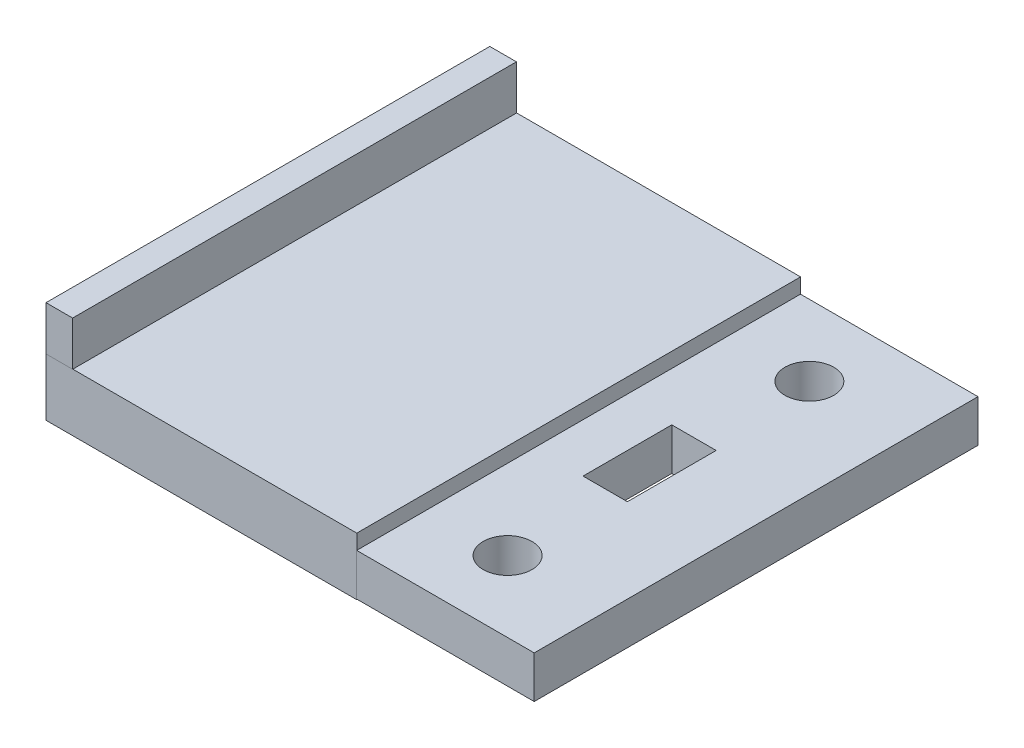
ISO-10303-21;
HEADER;
FILE_DESCRIPTION(('STEP AP214'),'2;1');
FILE_NAME('part.step','',(''),(''),'','','');
FILE_SCHEMA(('AUTOMOTIVE_DESIGN { 1 0 10303 214 1 1 1 1 }'));
ENDSEC;
DATA;
#1=APPLICATION_CONTEXT('core data for automotive mechanical design processes');
#2=APPLICATION_PROTOCOL_DEFINITION('international standard','automotive_design',2000,#1);
#3=PRODUCT_CONTEXT('',#1,'mechanical');
#4=PRODUCT('Part','Part','',(#3));
#5=PRODUCT_RELATED_PRODUCT_CATEGORY('part','',(#4));
#6=PRODUCT_DEFINITION_FORMATION('','',#4);
#7=PRODUCT_DEFINITION_CONTEXT('part definition',#1,'design');
#8=PRODUCT_DEFINITION('design','',#6,#7);
#9=PRODUCT_DEFINITION_SHAPE('','',#8);
#10=(LENGTH_UNIT() NAMED_UNIT(*) SI_UNIT(.MILLI.,.METRE.));
#11=(NAMED_UNIT(*) PLANE_ANGLE_UNIT() SI_UNIT($,.RADIAN.));
#12=(NAMED_UNIT(*) SI_UNIT($,.STERADIAN.) SOLID_ANGLE_UNIT());
#13=UNCERTAINTY_MEASURE_WITH_UNIT(LENGTH_MEASURE(1.E-05),#10,'distance_accuracy_value','');
#14=(GEOMETRIC_REPRESENTATION_CONTEXT(3) GLOBAL_UNCERTAINTY_ASSIGNED_CONTEXT((#13)) GLOBAL_UNIT_ASSIGNED_CONTEXT((#10,
#11,#12)) REPRESENTATION_CONTEXT('',''));
#15=CARTESIAN_POINT('',(0.,0.,0.));
#16=DIRECTION('',(0.,0.,1.));
#17=DIRECTION('',(1.,0.,0.));
#18=AXIS2_PLACEMENT_3D('',#15,#16,#17);
#19=CARTESIAN_POINT('',(-47.6282051282051,6.43167795209814,39.9582652280641));
#20=DIRECTION('',(0.,-1.,0.));
#21=DIRECTION('',(0.,0.,-1.));
#22=AXIS2_PLACEMENT_3D('',#19,#20,#21);
#23=PLANE('',#22);
#24=DIRECTION('',(0.,0.,1.));
#25=VECTOR('',#24,1.);
#26=CARTESIAN_POINT('',(-47.6196859344213,6.43167795209814,-10.0198406725056));
#27=LINE('',#26,#25);
#28=CARTESIAN_POINT('',(-47.6196859344213,6.43167795209814,-10.0198406725056));
#29=VERTEX_POINT('',#28);
#30=CARTESIAN_POINT('',(-47.6196859344213,6.43167795209814,39.9582652280641));
#31=VERTEX_POINT('',#30);
#32=EDGE_CURVE('E220',#29,#31,#27,.T.);
#33=ORIENTED_EDGE('',*,*,#32,.F.);
#34=DIRECTION('',(-1.,0.,0.));
#35=VECTOR('',#34,1.);
#36=CARTESIAN_POINT('',(-47.6196859344213,6.43167795209814,-10.0198406725056));
#37=LINE('',#36,#35);
#38=CARTESIAN_POINT('',(-44.6196859344213,6.43167795209814,-10.0198406725056));
#39=VERTEX_POINT('',#38);
#40=EDGE_CURVE('E210',#39,#29,#37,.T.);
#41=ORIENTED_EDGE('',*,*,#40,.F.);
#42=DIRECTION('',(0.,0.,-1.));
#43=VECTOR('',#42,1.);
#44=CARTESIAN_POINT('',(-44.6196859344213,6.43167795209814,-10.0198406725056));
#45=LINE('',#44,#43);
#46=CARTESIAN_POINT('',(-44.6196859344213,6.43167795209814,39.9582652280641));
#47=VERTEX_POINT('',#46);
#48=EDGE_CURVE('E231',#47,#39,#45,.T.);
#49=ORIENTED_EDGE('',*,*,#48,.F.);
#50=DIRECTION('',(1.,0.,0.));
#51=VECTOR('',#50,1.);
#52=CARTESIAN_POINT('',(-47.6282051282051,6.43167795209814,39.9582652280641));
#53=LINE('',#52,#51);
#54=CARTESIAN_POINT('',(-12.6282051282051,6.43167795209814,39.9582652280641));
#55=VERTEX_POINT('',#54);
#56=EDGE_CURVE('E290',#47,#55,#53,.T.);
#57=ORIENTED_EDGE('',*,*,#56,.T.);
#58=DIRECTION('',(0.,0.,-1.));
#59=VECTOR('',#58,1.);
#60=CARTESIAN_POINT('',(-12.6282051282051,6.43167795209814,39.9582652280641));
#61=LINE('',#60,#59);
#62=CARTESIAN_POINT('',(-12.6282051282051,6.43167795209814,-10.0417347719359));
#63=VERTEX_POINT('',#62);
#64=EDGE_CURVE('E270',#55,#63,#61,.T.);
#65=ORIENTED_EDGE('',*,*,#64,.T.);
#66=DIRECTION('',(1.,0.,0.));
#67=VECTOR('',#66,1.);
#68=CARTESIAN_POINT('',(-47.6282051282051,6.43167795209814,-10.0417347719359));
#69=LINE('',#68,#67);
#70=CARTESIAN_POINT('',(-47.6282051282051,6.43167795209814,-10.0417347719359));
#71=VERTEX_POINT('',#70);
#72=EDGE_CURVE('E286',#71,#63,#69,.T.);
#73=ORIENTED_EDGE('',*,*,#72,.F.);
#74=DIRECTION('',(0.,0.,-1.));
#75=VECTOR('',#74,1.);
#76=CARTESIAN_POINT('',(-47.6282051282051,6.43167795209814,39.9582652280641));
#77=LINE('',#76,#75);
#78=CARTESIAN_POINT('',(-47.6282051282051,6.43167795209814,39.9582652280641));
#79=VERTEX_POINT('',#78);
#80=EDGE_CURVE('E255',#79,#71,#77,.T.);
#81=ORIENTED_EDGE('',*,*,#80,.F.);
#82=EDGE_CURVE('E291',#79,#31,#53,.T.);
#83=ORIENTED_EDGE('',*,*,#82,.T.);
#84=EDGE_LOOP('',(#33,#41,#49,#57,#65,#73,#81,#83));
#85=FACE_BOUND('',#84,.T.);
#86=ADVANCED_FACE('F43',(#85),#23,.F.);
#87=CARTESIAN_POINT('',(-12.6282051282051,4.75,-10.0320512820513));
#88=DIRECTION('',(1.,0.,0.));
#89=DIRECTION('',(0.,0.,-1.));
#90=AXIS2_PLACEMENT_3D('',#87,#88,#89);
#91=PLANE('',#90);
#92=DIRECTION('',(0.,1.,0.));
#93=VECTOR('',#92,1.);
#94=CARTESIAN_POINT('',(-12.6282051282051,-0.0683220479018587,39.9582652280641));
#95=LINE('',#94,#93);
#96=CARTESIAN_POINT('',(-12.6282051282051,0.,39.9582652280641));
#97=VERTEX_POINT('',#96);
#98=CARTESIAN_POINT('',(-12.6282051282051,4.75,39.9582652280641));
#99=VERTEX_POINT('',#98);
#100=EDGE_CURVE('E271',#97,#99,#95,.T.);
#101=ORIENTED_EDGE('',*,*,#100,.F.);
#102=DIRECTION('',(0.,0.,1.));
#103=VECTOR('',#102,1.);
#104=CARTESIAN_POINT('',(-12.6282051282051,0.,-10.0320512820513));
#105=LINE('',#104,#103);
#106=CARTESIAN_POINT('',(-12.6282051282051,0.,39.9679487179487));
#107=VERTEX_POINT('',#106);
#108=EDGE_CURVE('E335',#97,#107,#105,.T.);
#109=ORIENTED_EDGE('',*,*,#108,.T.);
#110=DIRECTION('',(0.,-1.,0.));
#111=VECTOR('',#110,1.);
#112=CARTESIAN_POINT('',(-12.6282051282051,4.75,39.9679487179487));
#113=LINE('',#112,#111);
#114=CARTESIAN_POINT('',(-12.6282051282051,4.75,39.9679487179487));
#115=VERTEX_POINT('',#114);
#116=EDGE_CURVE('E345',#115,#107,#113,.T.);
#117=ORIENTED_EDGE('',*,*,#116,.F.);
#118=DIRECTION('',(0.,0.,1.));
#119=VECTOR('',#118,1.);
#120=CARTESIAN_POINT('',(-12.6282051282051,4.75,-10.0320512820513));
#121=LINE('',#120,#119);
#122=EDGE_CURVE('E321',#99,#115,#121,.T.);
#123=ORIENTED_EDGE('',*,*,#122,.F.);
#124=EDGE_LOOP('',(#101,#109,#117,#123));
#125=FACE_BOUND('',#124,.T.);
#126=ADVANCED_FACE('F383',(#125),#91,.F.);
#127=CARTESIAN_POINT('',(7.37179487179487,4.75,-10.0320512820513));
#128=DIRECTION('',(-1.,0.,0.));
#129=DIRECTION('',(0.,0.,1.));
#130=AXIS2_PLACEMENT_3D('',#127,#128,#129);
#131=PLANE('',#130);
#132=DIRECTION('',(0.,0.,-1.));
#133=VECTOR('',#132,1.);
#134=CARTESIAN_POINT('',(7.37179487179487,0.,-10.0320512820513));
#135=LINE('',#134,#133);
#136=CARTESIAN_POINT('',(7.37179487179488,0.,39.9679487179487));
#137=VERTEX_POINT('',#136);
#138=CARTESIAN_POINT('',(7.37179487179487,0.,-10.0320512820513));
#139=VERTEX_POINT('',#138);
#140=EDGE_CURVE('E301',#137,#139,#135,.T.);
#141=ORIENTED_EDGE('',*,*,#140,.T.);
#142=DIRECTION('',(0.,-1.,0.));
#143=VECTOR('',#142,1.);
#144=CARTESIAN_POINT('',(7.37179487179487,4.75,-10.0320512820513));
#145=LINE('',#144,#143);
#146=CARTESIAN_POINT('',(7.37179487179487,4.75,-10.0320512820513));
#147=VERTEX_POINT('',#146);
#148=EDGE_CURVE('E353',#147,#139,#145,.T.);
#149=ORIENTED_EDGE('',*,*,#148,.F.);
#150=DIRECTION('',(0.,0.,-1.));
#151=VECTOR('',#150,1.);
#152=CARTESIAN_POINT('',(7.37179487179487,4.75,-10.0320512820513));
#153=LINE('',#152,#151);
#154=CARTESIAN_POINT('',(7.37179487179488,4.75,39.9679487179487));
#155=VERTEX_POINT('',#154);
#156=EDGE_CURVE('E313',#155,#147,#153,.T.);
#157=ORIENTED_EDGE('',*,*,#156,.F.);
#158=DIRECTION('',(0.,-1.,0.));
#159=VECTOR('',#158,1.);
#160=CARTESIAN_POINT('',(7.37179487179488,4.75,39.9679487179487));
#161=LINE('',#160,#159);
#162=EDGE_CURVE('E328',#155,#137,#161,.T.);
#163=ORIENTED_EDGE('',*,*,#162,.T.);
#164=EDGE_LOOP('',(#141,#149,#157,#163));
#165=FACE_BOUND('',#164,.T.);
#166=ADVANCED_FACE('F45',(#165),#131,.F.);
#167=CARTESIAN_POINT('',(-12.6282051282051,4.75,-10.0320512820513));
#168=DIRECTION('',(0.,0.,1.));
#169=DIRECTION('',(1.,0.,0.));
#170=AXIS2_PLACEMENT_3D('',#167,#168,#169);
#171=PLANE('',#170);
#172=DIRECTION('',(-1.,0.,0.));
#173=VECTOR('',#172,1.);
#174=CARTESIAN_POINT('',(-12.6282051282051,0.,-10.0320512820513));
#175=LINE('',#174,#173);
#176=CARTESIAN_POINT('',(-12.6282051282051,0.,-10.0320512820513));
#177=VERTEX_POINT('',#176);
#178=EDGE_CURVE('E332',#139,#177,#175,.T.);
#179=ORIENTED_EDGE('',*,*,#178,.T.);
#180=DIRECTION('',(0.,-1.,0.));
#181=VECTOR('',#180,1.);
#182=CARTESIAN_POINT('',(-12.6282051282051,4.75,-10.0320512820513));
#183=LINE('',#182,#181);
#184=CARTESIAN_POINT('',(-12.6282051282051,4.75,-10.0320512820513));
#185=VERTEX_POINT('',#184);
#186=EDGE_CURVE('E349',#185,#177,#183,.T.);
#187=ORIENTED_EDGE('',*,*,#186,.F.);
#188=DIRECTION('',(-1.,0.,0.));
#189=VECTOR('',#188,1.);
#190=CARTESIAN_POINT('',(-12.6282051282051,4.75,-10.0320512820513));
#191=LINE('',#190,#189);
#192=EDGE_CURVE('E317',#147,#185,#191,.T.);
#193=ORIENTED_EDGE('',*,*,#192,.F.);
#194=ORIENTED_EDGE('',*,*,#148,.T.);
#195=EDGE_LOOP('',(#179,#187,#193,#194));
#196=FACE_BOUND('',#195,.T.);
#197=ADVANCED_FACE('F414',(#196),#171,.F.);
#198=CARTESIAN_POINT('',(-12.6282051282051,4.75,39.9679487179487));
#199=DIRECTION('',(0.,0.,-1.));
#200=DIRECTION('',(-1.,0.,0.));
#201=AXIS2_PLACEMENT_3D('',#198,#199,#200);
#202=PLANE('',#201);
#203=DIRECTION('',(1.,0.,0.));
#204=VECTOR('',#203,1.);
#205=CARTESIAN_POINT('',(-12.6282051282051,0.,39.9679487179487));
#206=LINE('',#205,#204);
#207=EDGE_CURVE('E318',#107,#137,#206,.T.);
#208=ORIENTED_EDGE('',*,*,#207,.T.);
#209=ORIENTED_EDGE('',*,*,#162,.F.);
#210=DIRECTION('',(1.,0.,0.));
#211=VECTOR('',#210,1.);
#212=CARTESIAN_POINT('',(-12.6282051282051,4.75,39.9679487179487));
#213=LINE('',#212,#211);
#214=EDGE_CURVE('E325',#115,#155,#213,.T.);
#215=ORIENTED_EDGE('',*,*,#214,.F.);
#216=ORIENTED_EDGE('',*,*,#116,.T.);
#217=EDGE_LOOP('',(#208,#209,#215,#216));
#218=FACE_BOUND('',#217,.T.);
#219=ADVANCED_FACE('F410',(#218),#202,.F.);
#220=CARTESIAN_POINT('',(0.,4.75,0.));
#221=DIRECTION('',(0.,1.,0.));
#222=DIRECTION('',(0.,0.,1.));
#223=AXIS2_PLACEMENT_3D('',#220,#221,#222);
#224=PLANE('',#223);
#225=DIRECTION('',(0.,0.,-1.));
#226=VECTOR('',#225,1.);
#227=CARTESIAN_POINT('',(-2.12820512820513,4.75,9.96794871794872));
#228=LINE('',#227,#226);
#229=CARTESIAN_POINT('',(-2.12820512820513,4.75,19.9679487179487));
#230=VERTEX_POINT('',#229);
#231=CARTESIAN_POINT('',(-2.12820512820513,4.75,9.96794871794872));
#232=VERTEX_POINT('',#231);
#233=EDGE_CURVE('E59',#230,#232,#228,.T.);
#234=ORIENTED_EDGE('',*,*,#233,.F.);
#235=DIRECTION('',(1.,0.,0.));
#236=VECTOR('',#235,1.);
#237=CARTESIAN_POINT('',(-7.12820512820513,4.75,19.9679487179487));
#238=LINE('',#237,#236);
#239=CARTESIAN_POINT('',(-7.12820512820513,4.75,19.9679487179487));
#240=VERTEX_POINT('',#239);
#241=EDGE_CURVE('E190',#240,#230,#238,.T.);
#242=ORIENTED_EDGE('',*,*,#241,.F.);
#243=DIRECTION('',(0.,0.,1.));
#244=VECTOR('',#243,1.);
#245=CARTESIAN_POINT('',(-7.12820512820513,4.75,9.96794871794872));
#246=LINE('',#245,#244);
#247=CARTESIAN_POINT('',(-7.12820512820513,4.75,9.96794871794872));
#248=VERTEX_POINT('',#247);
#249=EDGE_CURVE('E172',#248,#240,#246,.T.);
#250=ORIENTED_EDGE('',*,*,#249,.F.);
#251=DIRECTION('',(-1.,0.,0.));
#252=VECTOR('',#251,1.);
#253=CARTESIAN_POINT('',(-7.12820512820513,4.75,9.96794871794872));
#254=LINE('',#253,#252);
#255=EDGE_CURVE('E182',#232,#248,#254,.T.);
#256=ORIENTED_EDGE('',*,*,#255,.F.);
#257=EDGE_LOOP('',(#234,#242,#250,#256));
#258=FACE_BOUND('',#257,.T.);
#259=CARTESIAN_POINT('',(-3.62820512820512,4.75,-2.03205128205128));
#260=DIRECTION('',(0.,1.,0.));
#261=DIRECTION('',(0.,0.,1.));
#262=AXIS2_PLACEMENT_3D('',#259,#260,#261);
#263=CIRCLE('',#262,2.75);
#264=CARTESIAN_POINT('',(-3.62820512820512,4.75,0.717948717948718));
#265=VERTEX_POINT('',#264);
#266=EDGE_CURVE('E302',#265,#265,#263,.T.);
#267=ORIENTED_EDGE('',*,*,#266,.F.);
#268=EDGE_LOOP('',(#267));
#269=FACE_BOUND('',#268,.T.);
#270=CARTESIAN_POINT('',(-3.62820512820512,4.75,31.9679487179487));
#271=DIRECTION('',(0.,1.,0.));
#272=DIRECTION('',(0.,0.,1.));
#273=AXIS2_PLACEMENT_3D('',#270,#271,#272);
#274=CIRCLE('',#273,2.75);
#275=CARTESIAN_POINT('',(-3.62820512820512,4.75,34.7179487179487));
#276=VERTEX_POINT('',#275);
#277=EDGE_CURVE('E306',#276,#276,#274,.T.);
#278=ORIENTED_EDGE('',*,*,#277,.F.);
#279=EDGE_LOOP('',(#278));
#280=FACE_BOUND('',#279,.T.);
#281=ORIENTED_EDGE('',*,*,#156,.T.);
#282=ORIENTED_EDGE('',*,*,#192,.T.);
#283=EDGE_CURVE('E322',#185,#99,#121,.T.);
#284=ORIENTED_EDGE('',*,*,#283,.T.);
#285=ORIENTED_EDGE('',*,*,#122,.T.);
#286=ORIENTED_EDGE('',*,*,#214,.T.);
#287=EDGE_LOOP('',(#281,#282,#284,#285,#286));
#288=FACE_BOUND('',#287,.T.);
#289=ADVANCED_FACE('F187',(#258,#269,#280,#288),#224,.T.);
#290=CARTESIAN_POINT('',(0.,0.,0.));
#291=DIRECTION('',(0.,1.,0.));
#292=DIRECTION('',(0.,0.,1.));
#293=AXIS2_PLACEMENT_3D('',#290,#291,#292);
#294=PLANE('',#293);
#295=DIRECTION('',(1.,0.,0.));
#296=VECTOR('',#295,1.);
#297=CARTESIAN_POINT('',(0.,0.,19.9679487179487));
#298=LINE('',#297,#296);
#299=CARTESIAN_POINT('',(-7.12820512820513,0.,19.9679487179487));
#300=VERTEX_POINT('',#299);
#301=CARTESIAN_POINT('',(-2.12820512820513,0.,19.9679487179487));
#302=VERTEX_POINT('',#301);
#303=EDGE_CURVE('E52',#300,#302,#298,.T.);
#304=ORIENTED_EDGE('',*,*,#303,.T.);
#305=DIRECTION('',(0.,0.,-1.));
#306=VECTOR('',#305,1.);
#307=CARTESIAN_POINT('',(-2.12820512820513,0.,0.));
#308=LINE('',#307,#306);
#309=CARTESIAN_POINT('',(-2.12820512820513,0.,9.96794871794872));
#310=VERTEX_POINT('',#309);
#311=EDGE_CURVE('E11',#302,#310,#308,.T.);
#312=ORIENTED_EDGE('',*,*,#311,.T.);
#313=DIRECTION('',(-1.,0.,0.));
#314=VECTOR('',#313,1.);
#315=CARTESIAN_POINT('',(0.,0.,9.96794871794872));
#316=LINE('',#315,#314);
#317=CARTESIAN_POINT('',(-7.12820512820513,0.,9.96794871794872));
#318=VERTEX_POINT('',#317);
#319=EDGE_CURVE('E357',#310,#318,#316,.T.);
#320=ORIENTED_EDGE('',*,*,#319,.T.);
#321=DIRECTION('',(0.,0.,1.));
#322=VECTOR('',#321,1.);
#323=CARTESIAN_POINT('',(-7.12820512820513,0.,0.));
#324=LINE('',#323,#322);
#325=EDGE_CURVE('E175',#318,#300,#324,.T.);
#326=ORIENTED_EDGE('',*,*,#325,.T.);
#327=EDGE_LOOP('',(#304,#312,#320,#326));
#328=FACE_BOUND('',#327,.T.);
#329=CARTESIAN_POINT('',(-3.62820512820512,0.,-2.03205128205128));
#330=DIRECTION('',(0.,1.,0.));
#331=DIRECTION('',(0.,0.,1.));
#332=AXIS2_PLACEMENT_3D('',#329,#330,#331);
#333=CIRCLE('',#332,2.75);
#334=CARTESIAN_POINT('',(-3.62820512820512,0.,0.717948717948718));
#335=VERTEX_POINT('',#334);
#336=EDGE_CURVE('E297',#335,#335,#333,.T.);
#337=ORIENTED_EDGE('',*,*,#336,.T.);
#338=EDGE_LOOP('',(#337));
#339=FACE_BOUND('',#338,.T.);
#340=CARTESIAN_POINT('',(-3.62820512820512,0.,31.9679487179487));
#341=DIRECTION('',(0.,1.,0.));
#342=DIRECTION('',(0.,0.,1.));
#343=AXIS2_PLACEMENT_3D('',#340,#341,#342);
#344=CIRCLE('',#343,2.75);
#345=CARTESIAN_POINT('',(-3.62820512820512,0.,34.7179487179487));
#346=VERTEX_POINT('',#345);
#347=EDGE_CURVE('E295',#346,#346,#344,.T.);
#348=ORIENTED_EDGE('',*,*,#347,.T.);
#349=EDGE_LOOP('',(#348));
#350=FACE_BOUND('',#349,.T.);
#351=ORIENTED_EDGE('',*,*,#140,.F.);
#352=ORIENTED_EDGE('',*,*,#207,.F.);
#353=ORIENTED_EDGE('',*,*,#108,.F.);
#354=EDGE_CURVE('E336',#177,#97,#105,.T.);
#355=ORIENTED_EDGE('',*,*,#354,.F.);
#356=ORIENTED_EDGE('',*,*,#178,.F.);
#357=EDGE_LOOP('',(#351,#352,#353,#355,#356));
#358=FACE_BOUND('',#357,.T.);
#359=ADVANCED_FACE('F364',(#328,#339,#350,#358),#294,.F.);
#360=CARTESIAN_POINT('',(-3.62820512820512,0.,31.9679487179487));
#361=DIRECTION('',(0.,1.,0.));
#362=DIRECTION('',(0.,0.,1.));
#363=AXIS2_PLACEMENT_3D('',#360,#361,#362);
#364=CYLINDRICAL_SURFACE('',#363,2.75);
#365=ORIENTED_EDGE('',*,*,#347,.F.);
#366=EDGE_LOOP('',(#365));
#367=FACE_BOUND('',#366,.T.);
#368=ORIENTED_EDGE('',*,*,#277,.T.);
#369=EDGE_LOOP('',(#368));
#370=FACE_BOUND('',#369,.T.);
#371=ADVANCED_FACE('F403',(#367,#370),#364,.F.);
#372=CARTESIAN_POINT('',(-3.62820512820512,0.,-2.03205128205128));
#373=DIRECTION('',(0.,1.,0.));
#374=DIRECTION('',(0.,0.,1.));
#375=AXIS2_PLACEMENT_3D('',#372,#373,#374);
#376=CYLINDRICAL_SURFACE('',#375,2.75);
#377=ORIENTED_EDGE('',*,*,#336,.F.);
#378=EDGE_LOOP('',(#377));
#379=FACE_BOUND('',#378,.T.);
#380=ORIENTED_EDGE('',*,*,#266,.T.);
#381=EDGE_LOOP('',(#380));
#382=FACE_BOUND('',#381,.T.);
#383=ADVANCED_FACE('F400',(#379,#382),#376,.F.);
#384=CARTESIAN_POINT('',(-12.6282051282051,0.,0.));
#385=DIRECTION('',(-1.,0.,0.));
#386=DIRECTION('',(0.,0.,1.));
#387=AXIS2_PLACEMENT_3D('',#384,#385,#386);
#388=PLANE('',#387);
#389=ORIENTED_EDGE('',*,*,#186,.T.);
#390=ORIENTED_EDGE('',*,*,#354,.T.);
#391=CARTESIAN_POINT('',(-12.6282051282051,-0.0683220479018587,39.9582652280641));
#392=VERTEX_POINT('',#391);
#393=EDGE_CURVE('E266',#392,#97,#95,.T.);
#394=ORIENTED_EDGE('',*,*,#393,.F.);
#395=DIRECTION('',(0.,0.,1.));
#396=VECTOR('',#395,1.);
#397=CARTESIAN_POINT('',(-12.6282051282051,-0.0683220479018587,39.9582652280641));
#398=LINE('',#397,#396);
#399=CARTESIAN_POINT('',(-12.6282051282051,-0.0683220479018648,-10.0417347719359));
#400=VERTEX_POINT('',#399);
#401=EDGE_CURVE('E256',#400,#392,#398,.T.);
#402=ORIENTED_EDGE('',*,*,#401,.F.);
#403=DIRECTION('',(0.,-1.,0.));
#404=VECTOR('',#403,1.);
#405=CARTESIAN_POINT('',(-12.6282051282051,-0.0683220479018648,-10.0417347719359));
#406=LINE('',#405,#404);
#407=EDGE_CURVE('E274',#63,#400,#406,.T.);
#408=ORIENTED_EDGE('',*,*,#407,.F.);
#409=ORIENTED_EDGE('',*,*,#64,.F.);
#410=EDGE_CURVE('E250',#99,#55,#95,.T.);
#411=ORIENTED_EDGE('',*,*,#410,.F.);
#412=ORIENTED_EDGE('',*,*,#283,.F.);
#413=EDGE_LOOP('',(#389,#390,#394,#402,#408,#409,#411,#412));
#414=FACE_BOUND('',#413,.T.);
#415=ADVANCED_FACE('F398',(#414),#388,.F.);
#416=CARTESIAN_POINT('',(-47.6282051282051,-0.0683220479018587,39.9582652280641));
#417=DIRECTION('',(0.,0.,-1.));
#418=DIRECTION('',(-1.,0.,0.));
#419=AXIS2_PLACEMENT_3D('',#416,#417,#418);
#420=PLANE('',#419);
#421=ORIENTED_EDGE('',*,*,#393,.T.);
#422=ORIENTED_EDGE('',*,*,#100,.T.);
#423=ORIENTED_EDGE('',*,*,#410,.T.);
#424=ORIENTED_EDGE('',*,*,#56,.F.);
#425=EDGE_CURVE('E296',#31,#47,#53,.T.);
#426=ORIENTED_EDGE('',*,*,#425,.F.);
#427=ORIENTED_EDGE('',*,*,#82,.F.);
#428=DIRECTION('',(0.,1.,0.));
#429=VECTOR('',#428,1.);
#430=CARTESIAN_POINT('',(-47.6282051282051,-0.0683220479018587,39.9582652280641));
#431=LINE('',#430,#429);
#432=CARTESIAN_POINT('',(-47.6282051282051,-0.0683220479018587,39.9582652280641));
#433=VERTEX_POINT('',#432);
#434=EDGE_CURVE('E251',#433,#79,#431,.T.);
#435=ORIENTED_EDGE('',*,*,#434,.F.);
#436=DIRECTION('',(1.,0.,0.));
#437=VECTOR('',#436,1.);
#438=CARTESIAN_POINT('',(-47.6282051282051,-0.0683220479018587,39.9582652280641));
#439=LINE('',#438,#437);
#440=EDGE_CURVE('E265',#433,#392,#439,.T.);
#441=ORIENTED_EDGE('',*,*,#440,.T.);
#442=EDGE_LOOP('',(#421,#422,#423,#424,#426,#427,#435,#441));
#443=FACE_BOUND('',#442,.T.);
#444=ADVANCED_FACE('F395',(#443),#420,.F.);
#445=CARTESIAN_POINT('',(-47.6282051282051,-0.0683220479018648,-10.0417347719359));
#446=DIRECTION('',(0.,0.,1.));
#447=DIRECTION('',(1.,0.,0.));
#448=AXIS2_PLACEMENT_3D('',#445,#446,#447);
#449=PLANE('',#448);
#450=ORIENTED_EDGE('',*,*,#407,.T.);
#451=DIRECTION('',(1.,0.,0.));
#452=VECTOR('',#451,1.);
#453=CARTESIAN_POINT('',(-47.6282051282051,-0.0683220479018648,-10.0417347719359));
#454=LINE('',#453,#452);
#455=CARTESIAN_POINT('',(-47.6282051282051,-0.0683220479018648,-10.0417347719359));
#456=VERTEX_POINT('',#455);
#457=EDGE_CURVE('E282',#456,#400,#454,.T.);
#458=ORIENTED_EDGE('',*,*,#457,.F.);
#459=DIRECTION('',(0.,-1.,0.));
#460=VECTOR('',#459,1.);
#461=CARTESIAN_POINT('',(-47.6282051282051,-0.0683220479018648,-10.0417347719359));
#462=LINE('',#461,#460);
#463=EDGE_CURVE('E259',#71,#456,#462,.T.);
#464=ORIENTED_EDGE('',*,*,#463,.F.);
#465=ORIENTED_EDGE('',*,*,#72,.T.);
#466=EDGE_LOOP('',(#450,#458,#464,#465));
#467=FACE_BOUND('',#466,.T.);
#468=ADVANCED_FACE('F393',(#467),#449,.F.);
#469=CARTESIAN_POINT('',(-47.6282051282051,-0.0683220479018587,39.9582652280641));
#470=DIRECTION('',(0.,1.,0.));
#471=DIRECTION('',(0.,0.,1.));
#472=AXIS2_PLACEMENT_3D('',#469,#470,#471);
#473=PLANE('',#472);
#474=ORIENTED_EDGE('',*,*,#401,.T.);
#475=ORIENTED_EDGE('',*,*,#440,.F.);
#476=DIRECTION('',(0.,0.,1.));
#477=VECTOR('',#476,1.);
#478=CARTESIAN_POINT('',(-47.6282051282051,-0.0683220479018587,39.9582652280641));
#479=LINE('',#478,#477);
#480=EDGE_CURVE('E262',#456,#433,#479,.T.);
#481=ORIENTED_EDGE('',*,*,#480,.F.);
#482=ORIENTED_EDGE('',*,*,#457,.T.);
#483=EDGE_LOOP('',(#474,#475,#481,#482));
#484=FACE_BOUND('',#483,.T.);
#485=ADVANCED_FACE('F475',(#484),#473,.F.);
#486=CARTESIAN_POINT('',(-47.6282051282051,0.,0.));
#487=DIRECTION('',(-1.,0.,0.));
#488=DIRECTION('',(0.,0.,1.));
#489=AXIS2_PLACEMENT_3D('',#486,#487,#488);
#490=PLANE('',#489);
#491=ORIENTED_EDGE('',*,*,#434,.T.);
#492=ORIENTED_EDGE('',*,*,#80,.T.);
#493=ORIENTED_EDGE('',*,*,#463,.T.);
#494=ORIENTED_EDGE('',*,*,#480,.T.);
#495=EDGE_LOOP('',(#491,#492,#493,#494));
#496=FACE_BOUND('',#495,.T.);
#497=ADVANCED_FACE('F483',(#496),#490,.T.);
#498=CARTESIAN_POINT('',(0.,6.43167795209814,0.));
#499=DIRECTION('',(0.,1.,0.));
#500=DIRECTION('',(0.,0.,1.));
#501=AXIS2_PLACEMENT_3D('',#498,#499,#500);
#502=PLANE('',#501);
#503=CARTESIAN_POINT('',(-47.6196859344213,6.43167795209814,39.9801593274944));
#504=VERTEX_POINT('',#503);
#505=EDGE_CURVE('E200',#31,#504,#27,.T.);
#506=ORIENTED_EDGE('',*,*,#505,.F.);
#507=ORIENTED_EDGE('',*,*,#425,.T.);
#508=CARTESIAN_POINT('',(-44.6196859344213,6.43167795209814,39.9801593274944));
#509=VERTEX_POINT('',#508);
#510=EDGE_CURVE('E227',#509,#47,#45,.T.);
#511=ORIENTED_EDGE('',*,*,#510,.F.);
#512=DIRECTION('',(1.,0.,0.));
#513=VECTOR('',#512,1.);
#514=CARTESIAN_POINT('',(-47.6196859344213,6.43167795209814,39.9801593274944));
#515=LINE('',#514,#513);
#516=EDGE_CURVE('E224',#504,#509,#515,.T.);
#517=ORIENTED_EDGE('',*,*,#516,.F.);
#518=EDGE_LOOP('',(#506,#507,#511,#517));
#519=FACE_BOUND('',#518,.T.);
#520=ADVANCED_FACE('F455',(#519),#502,.F.);
#521=CARTESIAN_POINT('',(-47.6196859344213,11.4316779520981,-10.0198406725056));
#522=DIRECTION('',(1.,0.,0.));
#523=DIRECTION('',(0.,1.,0.));
#524=AXIS2_PLACEMENT_3D('',#521,#522,#523);
#525=PLANE('',#524);
#526=ORIENTED_EDGE('',*,*,#32,.T.);
#527=ORIENTED_EDGE('',*,*,#505,.T.);
#528=DIRECTION('',(0.,-1.,0.));
#529=VECTOR('',#528,1.);
#530=CARTESIAN_POINT('',(-47.6196859344213,11.4316779520981,39.9801593274944));
#531=LINE('',#530,#529);
#532=CARTESIAN_POINT('',(-47.6196859344213,11.4316779520981,39.9801593274944));
#533=VERTEX_POINT('',#532);
#534=EDGE_CURVE('E246',#533,#504,#531,.T.);
#535=ORIENTED_EDGE('',*,*,#534,.F.);
#536=DIRECTION('',(0.,0.,1.));
#537=VECTOR('',#536,1.);
#538=CARTESIAN_POINT('',(-47.6196859344213,11.4316779520981,-10.0198406725056));
#539=LINE('',#538,#537);
#540=CARTESIAN_POINT('',(-47.6196859344213,11.4316779520981,-10.0198406725056));
#541=VERTEX_POINT('',#540);
#542=EDGE_CURVE('E205',#541,#533,#539,.T.);
#543=ORIENTED_EDGE('',*,*,#542,.F.);
#544=DIRECTION('',(0.,-1.,0.));
#545=VECTOR('',#544,1.);
#546=CARTESIAN_POINT('',(-47.6196859344213,11.4316779520981,-10.0198406725056));
#547=LINE('',#546,#545);
#548=EDGE_CURVE('E219',#541,#29,#547,.T.);
#549=ORIENTED_EDGE('',*,*,#548,.T.);
#550=EDGE_LOOP('',(#526,#527,#535,#543,#549));
#551=FACE_BOUND('',#550,.T.);
#552=ADVANCED_FACE('F451',(#551),#525,.F.);
#553=CARTESIAN_POINT('',(-47.6196859344213,11.4316779520981,39.9801593274944));
#554=DIRECTION('',(0.,0.,-1.));
#555=DIRECTION('',(0.,1.,0.));
#556=AXIS2_PLACEMENT_3D('',#553,#554,#555);
#557=PLANE('',#556);
#558=ORIENTED_EDGE('',*,*,#516,.T.);
#559=DIRECTION('',(0.,-1.,0.));
#560=VECTOR('',#559,1.);
#561=CARTESIAN_POINT('',(-44.6196859344213,11.4316779520981,39.9801593274944));
#562=LINE('',#561,#560);
#563=CARTESIAN_POINT('',(-44.6196859344213,11.4316779520981,39.9801593274944));
#564=VERTEX_POINT('',#563);
#565=EDGE_CURVE('E242',#564,#509,#562,.T.);
#566=ORIENTED_EDGE('',*,*,#565,.F.);
#567=DIRECTION('',(1.,0.,0.));
#568=VECTOR('',#567,1.);
#569=CARTESIAN_POINT('',(-47.6196859344213,11.4316779520981,39.9801593274944));
#570=LINE('',#569,#568);
#571=EDGE_CURVE('E209',#533,#564,#570,.T.);
#572=ORIENTED_EDGE('',*,*,#571,.F.);
#573=ORIENTED_EDGE('',*,*,#534,.T.);
#574=EDGE_LOOP('',(#558,#566,#572,#573));
#575=FACE_BOUND('',#574,.T.);
#576=ADVANCED_FACE('F458',(#575),#557,.F.);
#577=CARTESIAN_POINT('',(-44.6196859344213,11.4316779520981,-10.0198406725056));
#578=DIRECTION('',(-1.,0.,0.));
#579=DIRECTION('',(0.,0.,1.));
#580=AXIS2_PLACEMENT_3D('',#577,#578,#579);
#581=PLANE('',#580);
#582=ORIENTED_EDGE('',*,*,#510,.T.);
#583=ORIENTED_EDGE('',*,*,#48,.T.);
#584=DIRECTION('',(0.,-1.,0.));
#585=VECTOR('',#584,1.);
#586=CARTESIAN_POINT('',(-44.6196859344213,11.4316779520981,-10.0198406725056));
#587=LINE('',#586,#585);
#588=CARTESIAN_POINT('',(-44.6196859344213,11.4316779520981,-10.0198406725056));
#589=VERTEX_POINT('',#588);
#590=EDGE_CURVE('E238',#589,#39,#587,.T.);
#591=ORIENTED_EDGE('',*,*,#590,.F.);
#592=DIRECTION('',(0.,0.,-1.));
#593=VECTOR('',#592,1.);
#594=CARTESIAN_POINT('',(-44.6196859344213,11.4316779520981,-10.0198406725056));
#595=LINE('',#594,#593);
#596=EDGE_CURVE('E213',#564,#589,#595,.T.);
#597=ORIENTED_EDGE('',*,*,#596,.F.);
#598=ORIENTED_EDGE('',*,*,#565,.T.);
#599=EDGE_LOOP('',(#582,#583,#591,#597,#598));
#600=FACE_BOUND('',#599,.T.);
#601=ADVANCED_FACE('F467',(#600),#581,.F.);
#602=CARTESIAN_POINT('',(-47.6196859344213,11.4316779520981,-10.0198406725056));
#603=DIRECTION('',(0.,0.,1.));
#604=DIRECTION('',(0.,-1.,0.));
#605=AXIS2_PLACEMENT_3D('',#602,#603,#604);
#606=PLANE('',#605);
#607=ORIENTED_EDGE('',*,*,#40,.T.);
#608=ORIENTED_EDGE('',*,*,#548,.F.);
#609=DIRECTION('',(-1.,0.,0.));
#610=VECTOR('',#609,1.);
#611=CARTESIAN_POINT('',(-47.6196859344213,11.4316779520981,-10.0198406725056));
#612=LINE('',#611,#610);
#613=EDGE_CURVE('E216',#589,#541,#612,.T.);
#614=ORIENTED_EDGE('',*,*,#613,.F.);
#615=ORIENTED_EDGE('',*,*,#590,.T.);
#616=EDGE_LOOP('',(#607,#608,#614,#615));
#617=FACE_BOUND('',#616,.T.);
#618=ADVANCED_FACE('F378',(#617),#606,.F.);
#619=CARTESIAN_POINT('',(0.,11.4316779520981,0.));
#620=DIRECTION('',(0.,1.,0.));
#621=DIRECTION('',(0.,0.,1.));
#622=AXIS2_PLACEMENT_3D('',#619,#620,#621);
#623=PLANE('',#622);
#624=ORIENTED_EDGE('',*,*,#542,.T.);
#625=ORIENTED_EDGE('',*,*,#571,.T.);
#626=ORIENTED_EDGE('',*,*,#596,.T.);
#627=ORIENTED_EDGE('',*,*,#613,.T.);
#628=EDGE_LOOP('',(#624,#625,#626,#627));
#629=FACE_BOUND('',#628,.T.);
#630=ADVANCED_FACE('F371',(#629),#623,.T.);
#631=CARTESIAN_POINT('',(-2.12820512820513,-0.75,9.96794871794872));
#632=DIRECTION('',(1.,0.,0.));
#633=DIRECTION('',(0.,0.,-1.));
#634=AXIS2_PLACEMENT_3D('',#631,#632,#633);
#635=PLANE('',#634);
#636=DIRECTION('',(0.,1.,0.));
#637=VECTOR('',#636,1.);
#638=CARTESIAN_POINT('',(-2.12820512820513,-0.75,19.9679487179487));
#639=LINE('',#638,#637);
#640=EDGE_CURVE('E197',#302,#230,#639,.T.);
#641=ORIENTED_EDGE('',*,*,#640,.T.);
#642=ORIENTED_EDGE('',*,*,#233,.T.);
#643=DIRECTION('',(0.,1.,0.));
#644=VECTOR('',#643,1.);
#645=CARTESIAN_POINT('',(-2.12820512820513,-0.75,9.96794871794872));
#646=LINE('',#645,#644);
#647=EDGE_CURVE('E179',#310,#232,#646,.T.);
#648=ORIENTED_EDGE('',*,*,#647,.F.);
#649=ORIENTED_EDGE('',*,*,#311,.F.);
#650=EDGE_LOOP('',(#641,#642,#648,#649));
#651=FACE_BOUND('',#650,.T.);
#652=ADVANCED_FACE('F369',(#651),#635,.F.);
#653=CARTESIAN_POINT('',(-7.12820512820513,-0.75,19.9679487179487));
#654=DIRECTION('',(0.,0.,1.));
#655=DIRECTION('',(1.,0.,0.));
#656=AXIS2_PLACEMENT_3D('',#653,#654,#655);
#657=PLANE('',#656);
#658=DIRECTION('',(0.,1.,0.));
#659=VECTOR('',#658,1.);
#660=CARTESIAN_POINT('',(-7.12820512820513,-0.75,19.9679487179487));
#661=LINE('',#660,#659);
#662=EDGE_CURVE('E178',#300,#240,#661,.T.);
#663=ORIENTED_EDGE('',*,*,#662,.T.);
#664=ORIENTED_EDGE('',*,*,#241,.T.);
#665=ORIENTED_EDGE('',*,*,#640,.F.);
#666=ORIENTED_EDGE('',*,*,#303,.F.);
#667=EDGE_LOOP('',(#663,#664,#665,#666));
#668=FACE_BOUND('',#667,.T.);
#669=ADVANCED_FACE('F368',(#668),#657,.F.);
#670=CARTESIAN_POINT('',(-7.12820512820513,-0.75,9.96794871794872));
#671=DIRECTION('',(-1.,0.,0.));
#672=DIRECTION('',(0.,0.,1.));
#673=AXIS2_PLACEMENT_3D('',#670,#671,#672);
#674=PLANE('',#673);
#675=DIRECTION('',(0.,1.,0.));
#676=VECTOR('',#675,1.);
#677=CARTESIAN_POINT('',(-7.12820512820513,-0.75,9.96794871794872));
#678=LINE('',#677,#676);
#679=EDGE_CURVE('E67',#318,#248,#678,.T.);
#680=ORIENTED_EDGE('',*,*,#679,.T.);
#681=ORIENTED_EDGE('',*,*,#249,.T.);
#682=ORIENTED_EDGE('',*,*,#662,.F.);
#683=ORIENTED_EDGE('',*,*,#325,.F.);
#684=EDGE_LOOP('',(#680,#681,#682,#683));
#685=FACE_BOUND('',#684,.T.);
#686=ADVANCED_FACE('F169',(#685),#674,.F.);
#687=CARTESIAN_POINT('',(-7.12820512820513,-0.75,9.96794871794872));
#688=DIRECTION('',(0.,0.,-1.));
#689=DIRECTION('',(-1.,0.,0.));
#690=AXIS2_PLACEMENT_3D('',#687,#688,#689);
#691=PLANE('',#690);
#692=ORIENTED_EDGE('',*,*,#647,.T.);
#693=ORIENTED_EDGE('',*,*,#255,.T.);
#694=ORIENTED_EDGE('',*,*,#679,.F.);
#695=ORIENTED_EDGE('',*,*,#319,.F.);
#696=EDGE_LOOP('',(#692,#693,#694,#695));
#697=FACE_BOUND('',#696,.T.);
#698=ADVANCED_FACE('F183',(#697),#691,.F.);
#699=CLOSED_SHELL('',(#86,#126,#166,#197,#219,#289,#359,#371,#383,#415,#444,#468,#485,#497,#520,
#552,#576,#601,#618,#630,#652,#669,#686,#698));
#700=MANIFOLD_SOLID_BREP('B2',#699);
#701=ADVANCED_BREP_SHAPE_REPRESENTATION('',(#18,#700),#14);
#702=SHAPE_DEFINITION_REPRESENTATION(#9,#701);
ENDSEC;
END-ISO-10303-21;
